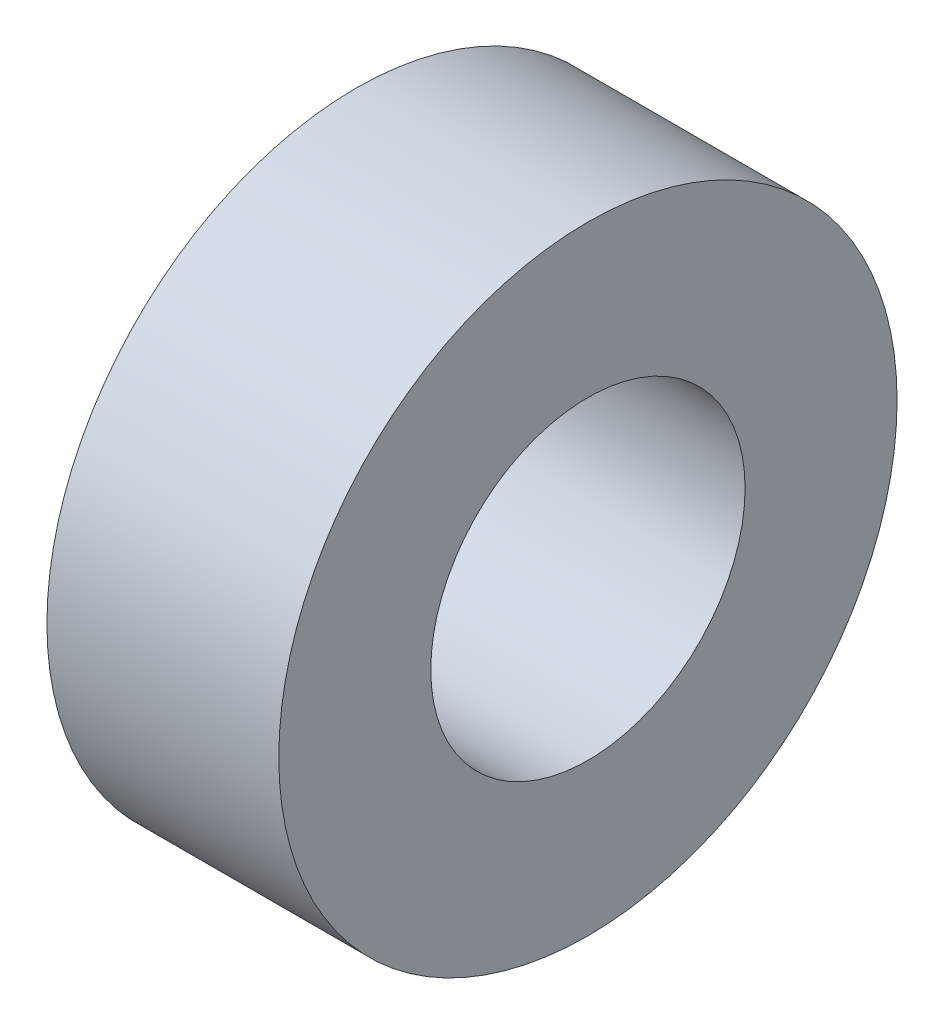
ISO-10303-21;
HEADER;
FILE_DESCRIPTION(('STEP AP214'),'2;1');
FILE_NAME('part.step','',(''),(''),'','','');
FILE_SCHEMA(('AUTOMOTIVE_DESIGN { 1 0 10303 214 1 1 1 1 }'));
ENDSEC;
DATA;
#1=APPLICATION_CONTEXT('core data for automotive mechanical design processes');
#2=APPLICATION_PROTOCOL_DEFINITION('international standard','automotive_design',2000,#1);
#3=PRODUCT_CONTEXT('',#1,'mechanical');
#4=PRODUCT('Part','Part','',(#3));
#5=PRODUCT_RELATED_PRODUCT_CATEGORY('part','',(#4));
#6=PRODUCT_DEFINITION_FORMATION('','',#4);
#7=PRODUCT_DEFINITION_CONTEXT('part definition',#1,'design');
#8=PRODUCT_DEFINITION('design','',#6,#7);
#9=PRODUCT_DEFINITION_SHAPE('','',#8);
#10=(LENGTH_UNIT() NAMED_UNIT(*) SI_UNIT(.MILLI.,.METRE.));
#11=(NAMED_UNIT(*) PLANE_ANGLE_UNIT() SI_UNIT($,.RADIAN.));
#12=(NAMED_UNIT(*) SI_UNIT($,.STERADIAN.) SOLID_ANGLE_UNIT());
#13=UNCERTAINTY_MEASURE_WITH_UNIT(LENGTH_MEASURE(1.E-05),#10,'distance_accuracy_value','');
#14=(GEOMETRIC_REPRESENTATION_CONTEXT(3) GLOBAL_UNCERTAINTY_ASSIGNED_CONTEXT((#13)) GLOBAL_UNIT_ASSIGNED_CONTEXT((#10,
#11,#12)) REPRESENTATION_CONTEXT('',''));
#15=CARTESIAN_POINT('',(0.,0.,0.));
#16=DIRECTION('',(0.,0.,1.));
#17=DIRECTION('',(1.,0.,0.));
#18=AXIS2_PLACEMENT_3D('',#15,#16,#17);
#19=CARTESIAN_POINT('',(19.5,-29.,-19.5));
#20=DIRECTION('',(-1.,0.,0.));
#21=DIRECTION('',(0.,0.,1.));
#22=AXIS2_PLACEMENT_3D('',#19,#20,#21);
#23=CYLINDRICAL_SURFACE('',#22,6.);
#24=CARTESIAN_POINT('',(19.5,-29.,-19.5));
#25=DIRECTION('',(1.,0.,0.));
#26=DIRECTION('',(0.,0.,-1.));
#27=AXIS2_PLACEMENT_3D('',#24,#25,#26);
#28=CIRCLE('',#27,6.);
#29=CARTESIAN_POINT('',(19.5,-29.,-25.5));
#30=VERTEX_POINT('',#29);
#31=EDGE_CURVE('E10',#30,#30,#28,.T.);
#32=ORIENTED_EDGE('',*,*,#31,.F.);
#33=EDGE_LOOP('',(#32));
#34=FACE_BOUND('',#33,.T.);
#35=CARTESIAN_POINT('',(15.,-29.,-19.5));
#36=DIRECTION('',(1.,0.,0.));
#37=DIRECTION('',(0.,0.,-1.));
#38=AXIS2_PLACEMENT_3D('',#35,#36,#37);
#39=CIRCLE('',#38,6.);
#40=CARTESIAN_POINT('',(15.,-29.,-25.5));
#41=VERTEX_POINT('',#40);
#42=EDGE_CURVE('E46',#41,#41,#39,.T.);
#43=ORIENTED_EDGE('',*,*,#42,.T.);
#44=EDGE_LOOP('',(#43));
#45=FACE_BOUND('',#44,.T.);
#46=ADVANCED_FACE('F39',(#34,#45),#23,.T.);
#47=CARTESIAN_POINT('',(19.5,-29.,-19.5));
#48=DIRECTION('',(1.,0.,0.));
#49=DIRECTION('',(0.,0.,-1.));
#50=AXIS2_PLACEMENT_3D('',#47,#48,#49);
#51=PLANE('',#50);
#52=CARTESIAN_POINT('',(19.5,-29.,-19.5));
#53=DIRECTION('',(1.,0.,0.));
#54=DIRECTION('',(0.,0.,-1.));
#55=AXIS2_PLACEMENT_3D('',#52,#53,#54);
#56=CIRCLE('',#55,3.05);
#57=CARTESIAN_POINT('',(19.5,-29.,-22.55));
#58=VERTEX_POINT('',#57);
#59=EDGE_CURVE('E51',#58,#58,#56,.F.);
#60=ORIENTED_EDGE('',*,*,#59,.T.);
#61=EDGE_LOOP('',(#60));
#62=FACE_BOUND('',#61,.T.);
#63=ORIENTED_EDGE('',*,*,#31,.T.);
#64=EDGE_LOOP('',(#63));
#65=FACE_BOUND('',#64,.T.);
#66=ADVANCED_FACE('F63',(#62,#65),#51,.T.);
#67=CARTESIAN_POINT('',(15.,-29.,-19.5));
#68=DIRECTION('',(1.,0.,0.));
#69=DIRECTION('',(0.,0.,-1.));
#70=AXIS2_PLACEMENT_3D('',#67,#68,#69);
#71=PLANE('',#70);
#72=CARTESIAN_POINT('',(15.,-29.,-19.5));
#73=DIRECTION('',(1.,0.,0.));
#74=DIRECTION('',(0.,0.,-1.));
#75=AXIS2_PLACEMENT_3D('',#72,#73,#74);
#76=CIRCLE('',#75,3.05);
#77=CARTESIAN_POINT('',(15.,-29.,-22.55));
#78=VERTEX_POINT('',#77);
#79=EDGE_CURVE('E45',#78,#78,#76,.F.);
#80=ORIENTED_EDGE('',*,*,#79,.F.);
#81=EDGE_LOOP('',(#80));
#82=FACE_BOUND('',#81,.T.);
#83=ORIENTED_EDGE('',*,*,#42,.F.);
#84=EDGE_LOOP('',(#83));
#85=FACE_BOUND('',#84,.T.);
#86=ADVANCED_FACE('F61',(#82,#85),#71,.F.);
#87=CARTESIAN_POINT('',(19.6,-29.,-19.5));
#88=DIRECTION('',(-1.,0.,0.));
#89=DIRECTION('',(0.,0.,1.));
#90=AXIS2_PLACEMENT_3D('',#87,#88,#89);
#91=CYLINDRICAL_SURFACE('',#90,3.05);
#92=ORIENTED_EDGE('',*,*,#59,.F.);
#93=EDGE_LOOP('',(#92));
#94=FACE_BOUND('',#93,.T.);
#95=ORIENTED_EDGE('',*,*,#79,.T.);
#96=EDGE_LOOP('',(#95));
#97=FACE_BOUND('',#96,.T.);
#98=ADVANCED_FACE('F56',(#94,#97),#91,.F.);
#99=CLOSED_SHELL('',(#46,#66,#86,#98));
#100=MANIFOLD_SOLID_BREP('B2',#99);
#101=ADVANCED_BREP_SHAPE_REPRESENTATION('',(#18,#100),#14);
#102=SHAPE_DEFINITION_REPRESENTATION(#9,#101);
ENDSEC;
END-ISO-10303-21;
